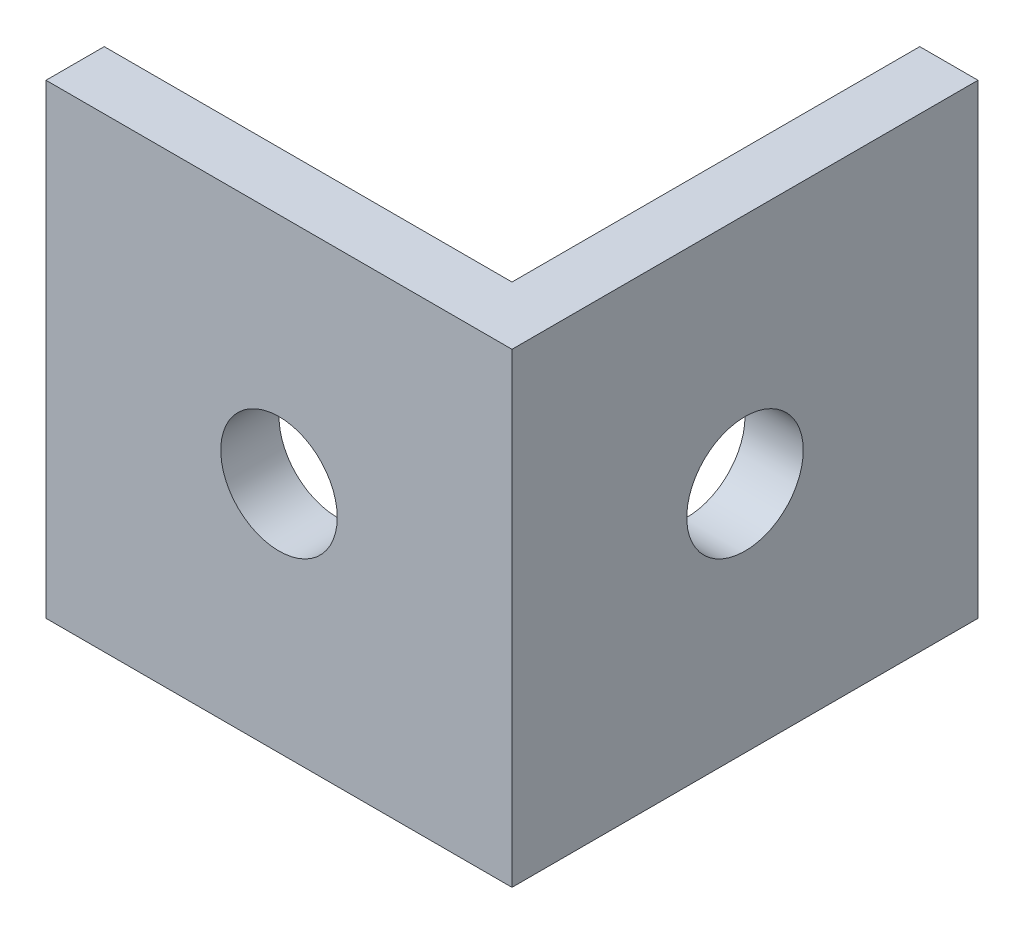
ISO-10303-21;
HEADER;
FILE_DESCRIPTION(('STEP AP214'),'2;1');
FILE_NAME('part.step','',(''),(''),'','','');
FILE_SCHEMA(('AUTOMOTIVE_DESIGN { 1 0 10303 214 1 1 1 1 }'));
ENDSEC;
DATA;
#1=APPLICATION_CONTEXT('core data for automotive mechanical design processes');
#2=APPLICATION_PROTOCOL_DEFINITION('international standard','automotive_design',2000,#1);
#3=PRODUCT_CONTEXT('',#1,'mechanical');
#4=PRODUCT('Part','Part','',(#3));
#5=PRODUCT_RELATED_PRODUCT_CATEGORY('part','',(#4));
#6=PRODUCT_DEFINITION_FORMATION('','',#4);
#7=PRODUCT_DEFINITION_CONTEXT('part definition',#1,'design');
#8=PRODUCT_DEFINITION('design','',#6,#7);
#9=PRODUCT_DEFINITION_SHAPE('','',#8);
#10=(LENGTH_UNIT() NAMED_UNIT(*) SI_UNIT(.MILLI.,.METRE.));
#11=(NAMED_UNIT(*) PLANE_ANGLE_UNIT() SI_UNIT($,.RADIAN.));
#12=(NAMED_UNIT(*) SI_UNIT($,.STERADIAN.) SOLID_ANGLE_UNIT());
#13=UNCERTAINTY_MEASURE_WITH_UNIT(LENGTH_MEASURE(1.E-05),#10,'distance_accuracy_value','');
#14=(GEOMETRIC_REPRESENTATION_CONTEXT(3) GLOBAL_UNCERTAINTY_ASSIGNED_CONTEXT((#13)) GLOBAL_UNIT_ASSIGNED_CONTEXT((#10,
#11,#12)) REPRESENTATION_CONTEXT('',''));
#15=CARTESIAN_POINT('',(0.,0.,0.));
#16=DIRECTION('',(0.,0.,1.));
#17=DIRECTION('',(1.,0.,0.));
#18=AXIS2_PLACEMENT_3D('',#15,#16,#17);
#19=CARTESIAN_POINT('',(0.,25.4,-3.175));
#20=DIRECTION('',(1.,0.,0.));
#21=DIRECTION('',(0.,0.,-1.));
#22=AXIS2_PLACEMENT_3D('',#19,#20,#21);
#23=PLANE('',#22);
#24=DIRECTION('',(0.,0.,1.));
#25=VECTOR('',#24,1.);
#26=CARTESIAN_POINT('',(0.,0.,-3.175));
#27=LINE('',#26,#25);
#28=CARTESIAN_POINT('',(0.,0.,-3.175));
#29=VERTEX_POINT('',#28);
#30=CARTESIAN_POINT('',(0.,0.,0.));
#31=VERTEX_POINT('',#30);
#32=EDGE_CURVE('E119',#29,#31,#27,.T.);
#33=ORIENTED_EDGE('',*,*,#32,.T.);
#34=DIRECTION('',(0.,-1.,0.));
#35=VECTOR('',#34,1.);
#36=CARTESIAN_POINT('',(0.,25.4,0.));
#37=LINE('',#36,#35);
#38=CARTESIAN_POINT('',(0.,25.4,0.));
#39=VERTEX_POINT('',#38);
#40=EDGE_CURVE('E11',#39,#31,#37,.T.);
#41=ORIENTED_EDGE('',*,*,#40,.F.);
#42=DIRECTION('',(0.,0.,1.));
#43=VECTOR('',#42,1.);
#44=CARTESIAN_POINT('',(0.,25.4,-3.175));
#45=LINE('',#44,#43);
#46=CARTESIAN_POINT('',(0.,25.4,-3.175));
#47=VERTEX_POINT('',#46);
#48=EDGE_CURVE('E130',#47,#39,#45,.T.);
#49=ORIENTED_EDGE('',*,*,#48,.F.);
#50=DIRECTION('',(0.,-1.,0.));
#51=VECTOR('',#50,1.);
#52=CARTESIAN_POINT('',(0.,25.4,-3.175));
#53=LINE('',#52,#51);
#54=EDGE_CURVE('E115',#47,#29,#53,.T.);
#55=ORIENTED_EDGE('',*,*,#54,.T.);
#56=EDGE_LOOP('',(#33,#41,#49,#55));
#57=FACE_BOUND('',#56,.T.);
#58=ADVANCED_FACE('F33',(#57),#23,.F.);
#59=CARTESIAN_POINT('',(0.,25.4,0.));
#60=DIRECTION('',(0.,0.,-1.));
#61=DIRECTION('',(-1.,0.,0.));
#62=AXIS2_PLACEMENT_3D('',#59,#60,#61);
#63=PLANE('',#62);
#64=CARTESIAN_POINT('',(12.7,12.7,0.));
#65=DIRECTION('',(0.,0.,1.));
#66=DIRECTION('',(1.,0.,0.));
#67=AXIS2_PLACEMENT_3D('',#64,#65,#66);
#68=CIRCLE('',#67,3.175);
#69=CARTESIAN_POINT('',(15.875,12.7,0.));
#70=VERTEX_POINT('',#69);
#71=EDGE_CURVE('E144',#70,#70,#68,.T.);
#72=ORIENTED_EDGE('',*,*,#71,.F.);
#73=EDGE_LOOP('',(#72));
#74=FACE_BOUND('',#73,.T.);
#75=DIRECTION('',(1.,0.,0.));
#76=VECTOR('',#75,1.);
#77=CARTESIAN_POINT('',(0.,0.,0.));
#78=LINE('',#77,#76);
#79=CARTESIAN_POINT('',(25.4,0.,0.));
#80=VERTEX_POINT('',#79);
#81=EDGE_CURVE('E122',#31,#80,#78,.T.);
#82=ORIENTED_EDGE('',*,*,#81,.T.);
#83=DIRECTION('',(0.,-1.,0.));
#84=VECTOR('',#83,1.);
#85=CARTESIAN_POINT('',(25.4,25.4,0.));
#86=LINE('',#85,#84);
#87=CARTESIAN_POINT('',(25.4,25.4,0.));
#88=VERTEX_POINT('',#87);
#89=EDGE_CURVE('E42',#88,#80,#86,.T.);
#90=ORIENTED_EDGE('',*,*,#89,.F.);
#91=DIRECTION('',(1.,0.,0.));
#92=VECTOR('',#91,1.);
#93=CARTESIAN_POINT('',(0.,25.4,0.));
#94=LINE('',#93,#92);
#95=EDGE_CURVE('E88',#39,#88,#94,.T.);
#96=ORIENTED_EDGE('',*,*,#95,.F.);
#97=ORIENTED_EDGE('',*,*,#40,.T.);
#98=EDGE_LOOP('',(#82,#90,#96,#97));
#99=FACE_BOUND('',#98,.T.);
#100=ADVANCED_FACE('F150',(#74,#99),#63,.F.);
#101=CARTESIAN_POINT('',(25.4,25.4,0.));
#102=DIRECTION('',(-1.,0.,0.));
#103=DIRECTION('',(0.,0.,1.));
#104=AXIS2_PLACEMENT_3D('',#101,#102,#103);
#105=PLANE('',#104);
#106=CARTESIAN_POINT('',(25.4,12.7,-12.7));
#107=DIRECTION('',(1.,0.,0.));
#108=DIRECTION('',(0.,0.,-1.));
#109=AXIS2_PLACEMENT_3D('',#106,#107,#108);
#110=CIRCLE('',#109,3.175);
#111=CARTESIAN_POINT('',(25.4,12.7,-15.875));
#112=VERTEX_POINT('',#111);
#113=EDGE_CURVE('E136',#112,#112,#110,.T.);
#114=ORIENTED_EDGE('',*,*,#113,.F.);
#115=EDGE_LOOP('',(#114));
#116=FACE_BOUND('',#115,.T.);
#117=DIRECTION('',(0.,0.,-1.));
#118=VECTOR('',#117,1.);
#119=CARTESIAN_POINT('',(25.4,0.,0.));
#120=LINE('',#119,#118);
#121=CARTESIAN_POINT('',(25.4,0.,-25.4));
#122=VERTEX_POINT('',#121);
#123=EDGE_CURVE('E125',#80,#122,#120,.T.);
#124=ORIENTED_EDGE('',*,*,#123,.T.);
#125=DIRECTION('',(0.,-1.,0.));
#126=VECTOR('',#125,1.);
#127=CARTESIAN_POINT('',(25.4,25.4,-25.4));
#128=LINE('',#127,#126);
#129=CARTESIAN_POINT('',(25.4,25.4,-25.4));
#130=VERTEX_POINT('',#129);
#131=EDGE_CURVE('E110',#130,#122,#128,.T.);
#132=ORIENTED_EDGE('',*,*,#131,.F.);
#133=DIRECTION('',(0.,0.,-1.));
#134=VECTOR('',#133,1.);
#135=CARTESIAN_POINT('',(25.4,25.4,0.));
#136=LINE('',#135,#134);
#137=EDGE_CURVE('E101',#88,#130,#136,.T.);
#138=ORIENTED_EDGE('',*,*,#137,.F.);
#139=ORIENTED_EDGE('',*,*,#89,.T.);
#140=EDGE_LOOP('',(#124,#132,#138,#139));
#141=FACE_BOUND('',#140,.T.);
#142=ADVANCED_FACE('F153',(#116,#141),#105,.F.);
#143=CARTESIAN_POINT('',(25.4,25.4,-25.4));
#144=DIRECTION('',(0.,0.,1.));
#145=DIRECTION('',(1.,0.,0.));
#146=AXIS2_PLACEMENT_3D('',#143,#144,#145);
#147=PLANE('',#146);
#148=DIRECTION('',(-1.,0.,0.));
#149=VECTOR('',#148,1.);
#150=CARTESIAN_POINT('',(25.4,0.,-25.4));
#151=LINE('',#150,#149);
#152=CARTESIAN_POINT('',(22.225,0.,-25.4));
#153=VERTEX_POINT('',#152);
#154=EDGE_CURVE('E109',#122,#153,#151,.T.);
#155=ORIENTED_EDGE('',*,*,#154,.T.);
#156=DIRECTION('',(0.,-1.,0.));
#157=VECTOR('',#156,1.);
#158=CARTESIAN_POINT('',(22.225,25.4,-25.4));
#159=LINE('',#158,#157);
#160=CARTESIAN_POINT('',(22.225,25.4,-25.4));
#161=VERTEX_POINT('',#160);
#162=EDGE_CURVE('E106',#161,#153,#159,.T.);
#163=ORIENTED_EDGE('',*,*,#162,.F.);
#164=DIRECTION('',(-1.,0.,0.));
#165=VECTOR('',#164,1.);
#166=CARTESIAN_POINT('',(25.4,25.4,-25.4));
#167=LINE('',#166,#165);
#168=EDGE_CURVE('E95',#130,#161,#167,.T.);
#169=ORIENTED_EDGE('',*,*,#168,.F.);
#170=ORIENTED_EDGE('',*,*,#131,.T.);
#171=EDGE_LOOP('',(#155,#163,#169,#170));
#172=FACE_BOUND('',#171,.T.);
#173=ADVANCED_FACE('F107',(#172),#147,.F.);
#174=CARTESIAN_POINT('',(22.225,25.4,-25.4));
#175=DIRECTION('',(1.,0.,0.));
#176=DIRECTION('',(0.,0.,-1.));
#177=AXIS2_PLACEMENT_3D('',#174,#175,#176);
#178=PLANE('',#177);
#179=CARTESIAN_POINT('',(22.225,12.7,-12.7));
#180=DIRECTION('',(1.,0.,0.));
#181=DIRECTION('',(0.,0.,-1.));
#182=AXIS2_PLACEMENT_3D('',#179,#180,#181);
#183=CIRCLE('',#182,3.175);
#184=CARTESIAN_POINT('',(22.225,12.7,-15.875));
#185=VERTEX_POINT('',#184);
#186=EDGE_CURVE('E123',#185,#185,#183,.T.);
#187=ORIENTED_EDGE('',*,*,#186,.T.);
#188=EDGE_LOOP('',(#187));
#189=FACE_BOUND('',#188,.T.);
#190=DIRECTION('',(0.,0.,1.));
#191=VECTOR('',#190,1.);
#192=CARTESIAN_POINT('',(22.225,0.,-25.4));
#193=LINE('',#192,#191);
#194=CARTESIAN_POINT('',(22.225,0.,-3.175));
#195=VERTEX_POINT('',#194);
#196=EDGE_CURVE('E74',#153,#195,#193,.T.);
#197=ORIENTED_EDGE('',*,*,#196,.T.);
#198=DIRECTION('',(0.,-1.,0.));
#199=VECTOR('',#198,1.);
#200=CARTESIAN_POINT('',(22.225,25.4,-3.175));
#201=LINE('',#200,#199);
#202=CARTESIAN_POINT('',(22.225,25.4,-3.175));
#203=VERTEX_POINT('',#202);
#204=EDGE_CURVE('E111',#203,#195,#201,.T.);
#205=ORIENTED_EDGE('',*,*,#204,.F.);
#206=DIRECTION('',(0.,0.,1.));
#207=VECTOR('',#206,1.);
#208=CARTESIAN_POINT('',(22.225,25.4,-25.4));
#209=LINE('',#208,#207);
#210=EDGE_CURVE('E99',#161,#203,#209,.T.);
#211=ORIENTED_EDGE('',*,*,#210,.F.);
#212=ORIENTED_EDGE('',*,*,#162,.T.);
#213=EDGE_LOOP('',(#197,#205,#211,#212));
#214=FACE_BOUND('',#213,.T.);
#215=ADVANCED_FACE('F113',(#189,#214),#178,.F.);
#216=CARTESIAN_POINT('',(22.225,25.4,-3.175));
#217=DIRECTION('',(0.,0.,1.));
#218=DIRECTION('',(1.,0.,0.));
#219=AXIS2_PLACEMENT_3D('',#216,#217,#218);
#220=PLANE('',#219);
#221=CARTESIAN_POINT('',(12.7,12.7,-3.175));
#222=DIRECTION('',(0.,0.,1.));
#223=DIRECTION('',(1.,0.,0.));
#224=AXIS2_PLACEMENT_3D('',#221,#222,#223);
#225=CIRCLE('',#224,3.175);
#226=CARTESIAN_POINT('',(15.875,12.7,-3.175));
#227=VERTEX_POINT('',#226);
#228=EDGE_CURVE('E36',#227,#227,#225,.T.);
#229=ORIENTED_EDGE('',*,*,#228,.T.);
#230=EDGE_LOOP('',(#229));
#231=FACE_BOUND('',#230,.T.);
#232=DIRECTION('',(-1.,0.,0.));
#233=VECTOR('',#232,1.);
#234=CARTESIAN_POINT('',(22.225,0.,-3.175));
#235=LINE('',#234,#233);
#236=EDGE_CURVE('E80',#195,#29,#235,.T.);
#237=ORIENTED_EDGE('',*,*,#236,.T.);
#238=ORIENTED_EDGE('',*,*,#54,.F.);
#239=DIRECTION('',(-1.,0.,0.));
#240=VECTOR('',#239,1.);
#241=CARTESIAN_POINT('',(22.225,25.4,-3.175));
#242=LINE('',#241,#240);
#243=EDGE_CURVE('E51',#203,#47,#242,.T.);
#244=ORIENTED_EDGE('',*,*,#243,.F.);
#245=ORIENTED_EDGE('',*,*,#204,.T.);
#246=EDGE_LOOP('',(#237,#238,#244,#245));
#247=FACE_BOUND('',#246,.T.);
#248=ADVANCED_FACE('F158',(#231,#247),#220,.F.);
#249=CARTESIAN_POINT('',(0.,25.4,0.));
#250=DIRECTION('',(0.,1.,0.));
#251=DIRECTION('',(0.,0.,1.));
#252=AXIS2_PLACEMENT_3D('',#249,#250,#251);
#253=PLANE('',#252);
#254=ORIENTED_EDGE('',*,*,#48,.T.);
#255=ORIENTED_EDGE('',*,*,#95,.T.);
#256=ORIENTED_EDGE('',*,*,#137,.T.);
#257=ORIENTED_EDGE('',*,*,#168,.T.);
#258=ORIENTED_EDGE('',*,*,#210,.T.);
#259=ORIENTED_EDGE('',*,*,#243,.T.);
#260=EDGE_LOOP('',(#254,#255,#256,#257,#258,#259));
#261=FACE_BOUND('',#260,.T.);
#262=ADVANCED_FACE('F97',(#261),#253,.T.);
#263=CARTESIAN_POINT('',(0.,0.,0.));
#264=DIRECTION('',(0.,1.,0.));
#265=DIRECTION('',(0.,0.,1.));
#266=AXIS2_PLACEMENT_3D('',#263,#264,#265);
#267=PLANE('',#266);
#268=ORIENTED_EDGE('',*,*,#32,.F.);
#269=ORIENTED_EDGE('',*,*,#236,.F.);
#270=ORIENTED_EDGE('',*,*,#196,.F.);
#271=ORIENTED_EDGE('',*,*,#154,.F.);
#272=ORIENTED_EDGE('',*,*,#123,.F.);
#273=ORIENTED_EDGE('',*,*,#81,.F.);
#274=EDGE_LOOP('',(#268,#269,#270,#271,#272,#273));
#275=FACE_BOUND('',#274,.T.);
#276=ADVANCED_FACE('F156',(#275),#267,.F.);
#277=CARTESIAN_POINT('',(0.,12.7,-12.7));
#278=DIRECTION('',(1.,0.,0.));
#279=DIRECTION('',(0.,0.,-1.));
#280=AXIS2_PLACEMENT_3D('',#277,#278,#279);
#281=CYLINDRICAL_SURFACE('',#280,3.175);
#282=ORIENTED_EDGE('',*,*,#113,.T.);
#283=EDGE_LOOP('',(#282));
#284=FACE_BOUND('',#283,.T.);
#285=ORIENTED_EDGE('',*,*,#186,.F.);
#286=EDGE_LOOP('',(#285));
#287=FACE_BOUND('',#286,.T.);
#288=ADVANCED_FACE('F200',(#284,#287),#281,.F.);
#289=CARTESIAN_POINT('',(12.7,12.7,-25.4));
#290=DIRECTION('',(0.,0.,1.));
#291=DIRECTION('',(1.,0.,0.));
#292=AXIS2_PLACEMENT_3D('',#289,#290,#291);
#293=CYLINDRICAL_SURFACE('',#292,3.175);
#294=ORIENTED_EDGE('',*,*,#71,.T.);
#295=EDGE_LOOP('',(#294));
#296=FACE_BOUND('',#295,.T.);
#297=ORIENTED_EDGE('',*,*,#228,.F.);
#298=EDGE_LOOP('',(#297));
#299=FACE_BOUND('',#298,.T.);
#300=ADVANCED_FACE('F204',(#296,#299),#293,.F.);
#301=CLOSED_SHELL('',(#58,#100,#142,#173,#215,#248,#262,#276,#288,#300));
#302=MANIFOLD_SOLID_BREP('B2',#301);
#303=ADVANCED_BREP_SHAPE_REPRESENTATION('',(#18,#302),#14);
#304=SHAPE_DEFINITION_REPRESENTATION(#9,#303);
ENDSEC;
END-ISO-10303-21;
